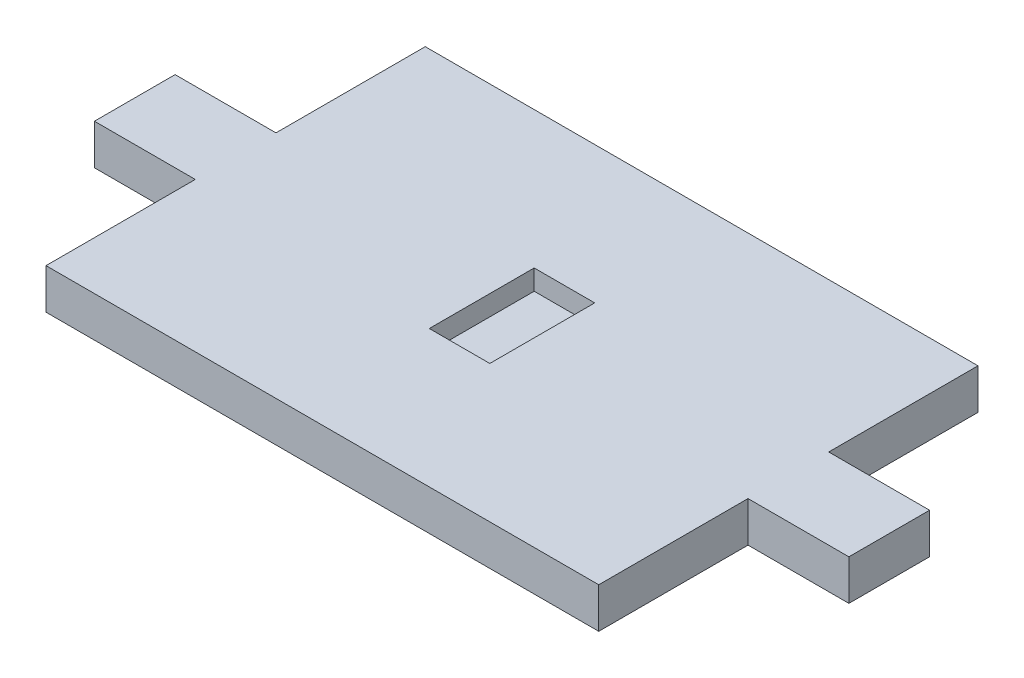
ISO-10303-21;
HEADER;
FILE_DESCRIPTION(('STEP AP214'),'2;1');
FILE_NAME('part.step','',(''),(''),'','','');
FILE_SCHEMA(('AUTOMOTIVE_DESIGN { 1 0 10303 214 1 1 1 1 }'));
ENDSEC;
DATA;
#1=APPLICATION_CONTEXT('core data for automotive mechanical design processes');
#2=APPLICATION_PROTOCOL_DEFINITION('international standard','automotive_design',2000,#1);
#3=PRODUCT_CONTEXT('',#1,'mechanical');
#4=PRODUCT('Part','Part','',(#3));
#5=PRODUCT_RELATED_PRODUCT_CATEGORY('part','',(#4));
#6=PRODUCT_DEFINITION_FORMATION('','',#4);
#7=PRODUCT_DEFINITION_CONTEXT('part definition',#1,'design');
#8=PRODUCT_DEFINITION('design','',#6,#7);
#9=PRODUCT_DEFINITION_SHAPE('','',#8);
#10=(LENGTH_UNIT() NAMED_UNIT(*) SI_UNIT(.MILLI.,.METRE.));
#11=(NAMED_UNIT(*) PLANE_ANGLE_UNIT() SI_UNIT($,.RADIAN.));
#12=(NAMED_UNIT(*) SI_UNIT($,.STERADIAN.) SOLID_ANGLE_UNIT());
#13=UNCERTAINTY_MEASURE_WITH_UNIT(LENGTH_MEASURE(1.E-05),#10,'distance_accuracy_value','');
#14=(GEOMETRIC_REPRESENTATION_CONTEXT(3) GLOBAL_UNCERTAINTY_ASSIGNED_CONTEXT((#13)) GLOBAL_UNIT_ASSIGNED_CONTEXT((#10,
#11,#12)) REPRESENTATION_CONTEXT('',''));
#15=CARTESIAN_POINT('',(0.,0.,0.));
#16=DIRECTION('',(0.,0.,1.));
#17=DIRECTION('',(1.,0.,0.));
#18=AXIS2_PLACEMENT_3D('',#15,#16,#17);
#19=CARTESIAN_POINT('',(-68.5000000000001,10.,-9.99999999999996));
#20=DIRECTION('',(0.,0.,1.));
#21=DIRECTION('',(1.,0.,0.));
#22=AXIS2_PLACEMENT_3D('',#19,#20,#21);
#23=PLANE('',#22);
#24=DIRECTION('',(-1.,0.,0.));
#25=VECTOR('',#24,1.);
#26=CARTESIAN_POINT('',(-68.5000000000001,0.,-9.99999999999996));
#27=LINE('',#26,#25);
#28=CARTESIAN_POINT('',(-68.5000000000001,0.,-9.99999999999996));
#29=VERTEX_POINT('',#28);
#30=CARTESIAN_POINT('',(-93.5000000000001,0.,-10.));
#31=VERTEX_POINT('',#30);
#32=EDGE_CURVE('E179',#29,#31,#27,.T.);
#33=ORIENTED_EDGE('',*,*,#32,.T.);
#34=DIRECTION('',(0.,-1.,0.));
#35=VECTOR('',#34,1.);
#36=CARTESIAN_POINT('',(-93.5000000000001,10.,-10.));
#37=LINE('',#36,#35);
#38=CARTESIAN_POINT('',(-93.5000000000001,10.,-10.));
#39=VERTEX_POINT('',#38);
#40=EDGE_CURVE('E11',#39,#31,#37,.T.);
#41=ORIENTED_EDGE('',*,*,#40,.F.);
#42=DIRECTION('',(-1.,0.,0.));
#43=VECTOR('',#42,1.);
#44=CARTESIAN_POINT('',(-68.5000000000001,10.,-9.99999999999996));
#45=LINE('',#44,#43);
#46=CARTESIAN_POINT('',(-68.5000000000001,10.,-9.99999999999996));
#47=VERTEX_POINT('',#46);
#48=EDGE_CURVE('E203',#47,#39,#45,.T.);
#49=ORIENTED_EDGE('',*,*,#48,.F.);
#50=DIRECTION('',(0.,-1.,0.));
#51=VECTOR('',#50,1.);
#52=CARTESIAN_POINT('',(-68.5000000000001,10.,-9.99999999999996));
#53=LINE('',#52,#51);
#54=EDGE_CURVE('E175',#47,#29,#53,.T.);
#55=ORIENTED_EDGE('',*,*,#54,.T.);
#56=EDGE_LOOP('',(#33,#41,#49,#55));
#57=FACE_BOUND('',#56,.T.);
#58=ADVANCED_FACE('F47',(#57),#23,.F.);
#59=CARTESIAN_POINT('',(-93.5000000000001,10.,10.));
#60=DIRECTION('',(1.,0.,0.));
#61=DIRECTION('',(0.,0.,-1.));
#62=AXIS2_PLACEMENT_3D('',#59,#60,#61);
#63=PLANE('',#62);
#64=DIRECTION('',(0.,0.,1.));
#65=VECTOR('',#64,1.);
#66=CARTESIAN_POINT('',(-93.5000000000001,0.,10.));
#67=LINE('',#66,#65);
#68=CARTESIAN_POINT('',(-93.5000000000001,0.,10.));
#69=VERTEX_POINT('',#68);
#70=EDGE_CURVE('E182',#31,#69,#67,.T.);
#71=ORIENTED_EDGE('',*,*,#70,.T.);
#72=DIRECTION('',(0.,-1.,0.));
#73=VECTOR('',#72,1.);
#74=CARTESIAN_POINT('',(-93.5000000000001,10.,10.));
#75=LINE('',#74,#73);
#76=CARTESIAN_POINT('',(-93.5000000000001,10.,10.));
#77=VERTEX_POINT('',#76);
#78=EDGE_CURVE('E54',#77,#69,#75,.T.);
#79=ORIENTED_EDGE('',*,*,#78,.F.);
#80=DIRECTION('',(0.,0.,1.));
#81=VECTOR('',#80,1.);
#82=CARTESIAN_POINT('',(-93.5000000000001,10.,10.));
#83=LINE('',#82,#81);
#84=EDGE_CURVE('E123',#39,#77,#83,.T.);
#85=ORIENTED_EDGE('',*,*,#84,.F.);
#86=ORIENTED_EDGE('',*,*,#40,.T.);
#87=EDGE_LOOP('',(#71,#79,#85,#86));
#88=FACE_BOUND('',#87,.T.);
#89=ADVANCED_FACE('F344',(#88),#63,.F.);
#90=CARTESIAN_POINT('',(-68.5000000000001,10.,9.99999999999996));
#91=DIRECTION('',(0.,0.,-1.));
#92=DIRECTION('',(-1.,0.,0.));
#93=AXIS2_PLACEMENT_3D('',#90,#91,#92);
#94=PLANE('',#93);
#95=DIRECTION('',(1.,0.,0.));
#96=VECTOR('',#95,1.);
#97=CARTESIAN_POINT('',(-68.5000000000001,0.,9.99999999999996));
#98=LINE('',#97,#96);
#99=CARTESIAN_POINT('',(-68.5000000000001,0.,9.99999999999996));
#100=VERTEX_POINT('',#99);
#101=EDGE_CURVE('E185',#69,#100,#98,.T.);
#102=ORIENTED_EDGE('',*,*,#101,.T.);
#103=DIRECTION('',(0.,-1.,0.));
#104=VECTOR('',#103,1.);
#105=CARTESIAN_POINT('',(-68.5000000000001,10.,9.99999999999996));
#106=LINE('',#105,#104);
#107=CARTESIAN_POINT('',(-68.5000000000001,10.,9.99999999999996));
#108=VERTEX_POINT('',#107);
#109=EDGE_CURVE('E222',#108,#100,#106,.T.);
#110=ORIENTED_EDGE('',*,*,#109,.F.);
#111=DIRECTION('',(1.,0.,0.));
#112=VECTOR('',#111,1.);
#113=CARTESIAN_POINT('',(-68.5000000000001,10.,9.99999999999996));
#114=LINE('',#113,#112);
#115=EDGE_CURVE('E230',#77,#108,#114,.T.);
#116=ORIENTED_EDGE('',*,*,#115,.F.);
#117=ORIENTED_EDGE('',*,*,#78,.T.);
#118=EDGE_LOOP('',(#102,#110,#116,#117));
#119=FACE_BOUND('',#118,.T.);
#120=ADVANCED_FACE('F228',(#119),#94,.F.);
#121=CARTESIAN_POINT('',(-68.5000000000001,10.,9.99999999999996));
#122=DIRECTION('',(1.,0.,0.));
#123=DIRECTION('',(0.,0.,-1.));
#124=AXIS2_PLACEMENT_3D('',#121,#122,#123);
#125=PLANE('',#124);
#126=DIRECTION('',(0.,0.,1.));
#127=VECTOR('',#126,1.);
#128=CARTESIAN_POINT('',(-68.5000000000001,0.,9.99999999999996));
#129=LINE('',#128,#127);
#130=CARTESIAN_POINT('',(-68.5000000000001,0.,47.));
#131=VERTEX_POINT('',#130);
#132=EDGE_CURVE('E187',#100,#131,#129,.T.);
#133=ORIENTED_EDGE('',*,*,#132,.T.);
#134=DIRECTION('',(0.,-1.,0.));
#135=VECTOR('',#134,1.);
#136=CARTESIAN_POINT('',(-68.5000000000001,10.,47.));
#137=LINE('',#136,#135);
#138=CARTESIAN_POINT('',(-68.5000000000001,10.,47.));
#139=VERTEX_POINT('',#138);
#140=EDGE_CURVE('E219',#139,#131,#137,.T.);
#141=ORIENTED_EDGE('',*,*,#140,.F.);
#142=DIRECTION('',(0.,0.,1.));
#143=VECTOR('',#142,1.);
#144=CARTESIAN_POINT('',(-68.5000000000001,10.,9.99999999999996));
#145=LINE('',#144,#143);
#146=EDGE_CURVE('E248',#108,#139,#145,.T.);
#147=ORIENTED_EDGE('',*,*,#146,.F.);
#148=ORIENTED_EDGE('',*,*,#109,.T.);
#149=EDGE_LOOP('',(#133,#141,#147,#148));
#150=FACE_BOUND('',#149,.T.);
#151=ADVANCED_FACE('F239',(#150),#125,.F.);
#152=CARTESIAN_POINT('',(-68.5000000000001,10.,47.));
#153=DIRECTION('',(0.,0.,-1.));
#154=DIRECTION('',(-1.,0.,0.));
#155=AXIS2_PLACEMENT_3D('',#152,#153,#154);
#156=PLANE('',#155);
#157=DIRECTION('',(1.,0.,0.));
#158=VECTOR('',#157,1.);
#159=CARTESIAN_POINT('',(-68.5000000000001,0.,47.));
#160=LINE('',#159,#158);
#161=CARTESIAN_POINT('',(68.4999999999999,0.,47.));
#162=VERTEX_POINT('',#161);
#163=EDGE_CURVE('E189',#131,#162,#160,.T.);
#164=ORIENTED_EDGE('',*,*,#163,.T.);
#165=DIRECTION('',(0.,-1.,0.));
#166=VECTOR('',#165,1.);
#167=CARTESIAN_POINT('',(68.4999999999999,10.,47.));
#168=LINE('',#167,#166);
#169=CARTESIAN_POINT('',(68.4999999999999,10.,47.));
#170=VERTEX_POINT('',#169);
#171=EDGE_CURVE('E216',#170,#162,#168,.T.);
#172=ORIENTED_EDGE('',*,*,#171,.F.);
#173=DIRECTION('',(1.,0.,0.));
#174=VECTOR('',#173,1.);
#175=CARTESIAN_POINT('',(-68.5000000000001,10.,47.));
#176=LINE('',#175,#174);
#177=EDGE_CURVE('E245',#139,#170,#176,.T.);
#178=ORIENTED_EDGE('',*,*,#177,.F.);
#179=ORIENTED_EDGE('',*,*,#140,.T.);
#180=EDGE_LOOP('',(#164,#172,#178,#179));
#181=FACE_BOUND('',#180,.T.);
#182=ADVANCED_FACE('F243',(#181),#156,.F.);
#183=CARTESIAN_POINT('',(68.4999999999999,10.,9.99999999999997));
#184=DIRECTION('',(-1.,0.,0.));
#185=DIRECTION('',(0.,0.,1.));
#186=AXIS2_PLACEMENT_3D('',#183,#184,#185);
#187=PLANE('',#186);
#188=DIRECTION('',(0.,0.,-1.));
#189=VECTOR('',#188,1.);
#190=CARTESIAN_POINT('',(68.4999999999999,0.,9.99999999999997));
#191=LINE('',#190,#189);
#192=CARTESIAN_POINT('',(68.4999999999999,0.,9.99999999999997));
#193=VERTEX_POINT('',#192);
#194=EDGE_CURVE('E191',#162,#193,#191,.T.);
#195=ORIENTED_EDGE('',*,*,#194,.T.);
#196=DIRECTION('',(0.,-1.,0.));
#197=VECTOR('',#196,1.);
#198=CARTESIAN_POINT('',(68.4999999999999,10.,9.99999999999997));
#199=LINE('',#198,#197);
#200=CARTESIAN_POINT('',(68.4999999999999,10.,9.99999999999997));
#201=VERTEX_POINT('',#200);
#202=EDGE_CURVE('E213',#201,#193,#199,.T.);
#203=ORIENTED_EDGE('',*,*,#202,.F.);
#204=DIRECTION('',(0.,0.,-1.));
#205=VECTOR('',#204,1.);
#206=CARTESIAN_POINT('',(68.4999999999999,10.,9.99999999999997));
#207=LINE('',#206,#205);
#208=EDGE_CURVE('E247',#170,#201,#207,.T.);
#209=ORIENTED_EDGE('',*,*,#208,.F.);
#210=ORIENTED_EDGE('',*,*,#171,.T.);
#211=EDGE_LOOP('',(#195,#203,#209,#210));
#212=FACE_BOUND('',#211,.T.);
#213=ADVANCED_FACE('F357',(#212),#187,.F.);
#214=CARTESIAN_POINT('',(93.4999999999999,10.,9.99999999999998));
#215=DIRECTION('',(0.,0.,-1.));
#216=DIRECTION('',(-1.,0.,0.));
#217=AXIS2_PLACEMENT_3D('',#214,#215,#216);
#218=PLANE('',#217);
#219=DIRECTION('',(1.,0.,0.));
#220=VECTOR('',#219,1.);
#221=CARTESIAN_POINT('',(93.4999999999999,0.,9.99999999999998));
#222=LINE('',#221,#220);
#223=CARTESIAN_POINT('',(93.4999999999999,0.,9.99999999999998));
#224=VERTEX_POINT('',#223);
#225=EDGE_CURVE('E193',#193,#224,#222,.T.);
#226=ORIENTED_EDGE('',*,*,#225,.T.);
#227=DIRECTION('',(0.,-1.,0.));
#228=VECTOR('',#227,1.);
#229=CARTESIAN_POINT('',(93.4999999999999,10.,9.99999999999998));
#230=LINE('',#229,#228);
#231=CARTESIAN_POINT('',(93.4999999999999,10.,9.99999999999998));
#232=VERTEX_POINT('',#231);
#233=EDGE_CURVE('E210',#232,#224,#230,.T.);
#234=ORIENTED_EDGE('',*,*,#233,.F.);
#235=DIRECTION('',(1.,0.,0.));
#236=VECTOR('',#235,1.);
#237=CARTESIAN_POINT('',(93.4999999999999,10.,9.99999999999998));
#238=LINE('',#237,#236);
#239=EDGE_CURVE('E250',#201,#232,#238,.T.);
#240=ORIENTED_EDGE('',*,*,#239,.F.);
#241=ORIENTED_EDGE('',*,*,#202,.T.);
#242=EDGE_LOOP('',(#226,#234,#240,#241));
#243=FACE_BOUND('',#242,.T.);
#244=ADVANCED_FACE('F360',(#243),#218,.F.);
#245=CARTESIAN_POINT('',(93.4999999999999,10.,9.99999999999998));
#246=DIRECTION('',(-1.,0.,0.));
#247=DIRECTION('',(0.,0.,1.));
#248=AXIS2_PLACEMENT_3D('',#245,#246,#247);
#249=PLANE('',#248);
#250=DIRECTION('',(0.,0.,-1.));
#251=VECTOR('',#250,1.);
#252=CARTESIAN_POINT('',(93.4999999999999,0.,9.99999999999998));
#253=LINE('',#252,#251);
#254=CARTESIAN_POINT('',(93.4999999999999,0.,-9.99999999999998));
#255=VERTEX_POINT('',#254);
#256=EDGE_CURVE('E195',#224,#255,#253,.T.);
#257=ORIENTED_EDGE('',*,*,#256,.T.);
#258=DIRECTION('',(0.,-1.,0.));
#259=VECTOR('',#258,1.);
#260=CARTESIAN_POINT('',(93.4999999999999,10.,-9.99999999999998));
#261=LINE('',#260,#259);
#262=CARTESIAN_POINT('',(93.4999999999999,10.,-9.99999999999998));
#263=VERTEX_POINT('',#262);
#264=EDGE_CURVE('E207',#263,#255,#261,.T.);
#265=ORIENTED_EDGE('',*,*,#264,.F.);
#266=DIRECTION('',(0.,0.,-1.));
#267=VECTOR('',#266,1.);
#268=CARTESIAN_POINT('',(93.4999999999999,10.,9.99999999999998));
#269=LINE('',#268,#267);
#270=EDGE_CURVE('E256',#232,#263,#269,.T.);
#271=ORIENTED_EDGE('',*,*,#270,.F.);
#272=ORIENTED_EDGE('',*,*,#233,.T.);
#273=EDGE_LOOP('',(#257,#265,#271,#272));
#274=FACE_BOUND('',#273,.T.);
#275=ADVANCED_FACE('F262',(#274),#249,.F.);
#276=CARTESIAN_POINT('',(93.4999999999999,10.,-9.99999999999998));
#277=DIRECTION('',(0.,0.,1.));
#278=DIRECTION('',(1.,0.,0.));
#279=AXIS2_PLACEMENT_3D('',#276,#277,#278);
#280=PLANE('',#279);
#281=DIRECTION('',(-1.,0.,0.));
#282=VECTOR('',#281,1.);
#283=CARTESIAN_POINT('',(93.4999999999999,0.,-9.99999999999998));
#284=LINE('',#283,#282);
#285=CARTESIAN_POINT('',(68.4999999999999,0.,-9.99999999999997));
#286=VERTEX_POINT('',#285);
#287=EDGE_CURVE('E197',#255,#286,#284,.T.);
#288=ORIENTED_EDGE('',*,*,#287,.T.);
#289=DIRECTION('',(0.,-1.,0.));
#290=VECTOR('',#289,1.);
#291=CARTESIAN_POINT('',(68.4999999999999,10.,-9.99999999999997));
#292=LINE('',#291,#290);
#293=CARTESIAN_POINT('',(68.4999999999999,10.,-9.99999999999997));
#294=VERTEX_POINT('',#293);
#295=EDGE_CURVE('E170',#294,#286,#292,.T.);
#296=ORIENTED_EDGE('',*,*,#295,.F.);
#297=DIRECTION('',(-1.,0.,0.));
#298=VECTOR('',#297,1.);
#299=CARTESIAN_POINT('',(93.4999999999999,10.,-9.99999999999998));
#300=LINE('',#299,#298);
#301=EDGE_CURVE('E158',#263,#294,#300,.T.);
#302=ORIENTED_EDGE('',*,*,#301,.F.);
#303=ORIENTED_EDGE('',*,*,#264,.T.);
#304=EDGE_LOOP('',(#288,#296,#302,#303));
#305=FACE_BOUND('',#304,.T.);
#306=ADVANCED_FACE('F266',(#305),#280,.F.);
#307=CARTESIAN_POINT('',(68.4999999999999,10.,-9.99999999999997));
#308=DIRECTION('',(-1.,0.,0.));
#309=DIRECTION('',(0.,0.,1.));
#310=AXIS2_PLACEMENT_3D('',#307,#308,#309);
#311=PLANE('',#310);
#312=DIRECTION('',(0.,0.,-1.));
#313=VECTOR('',#312,1.);
#314=CARTESIAN_POINT('',(68.4999999999999,0.,-9.99999999999997));
#315=LINE('',#314,#313);
#316=CARTESIAN_POINT('',(68.4999999999999,0.,-47.));
#317=VERTEX_POINT('',#316);
#318=EDGE_CURVE('E167',#286,#317,#315,.T.);
#319=ORIENTED_EDGE('',*,*,#318,.T.);
#320=DIRECTION('',(0.,-1.,0.));
#321=VECTOR('',#320,1.);
#322=CARTESIAN_POINT('',(68.4999999999999,10.,-47.));
#323=LINE('',#322,#321);
#324=CARTESIAN_POINT('',(68.4999999999999,10.,-47.));
#325=VERTEX_POINT('',#324);
#326=EDGE_CURVE('E164',#325,#317,#323,.T.);
#327=ORIENTED_EDGE('',*,*,#326,.F.);
#328=DIRECTION('',(0.,0.,-1.));
#329=VECTOR('',#328,1.);
#330=CARTESIAN_POINT('',(68.4999999999999,10.,-9.99999999999997));
#331=LINE('',#330,#329);
#332=EDGE_CURVE('E151',#294,#325,#331,.T.);
#333=ORIENTED_EDGE('',*,*,#332,.F.);
#334=ORIENTED_EDGE('',*,*,#295,.T.);
#335=EDGE_LOOP('',(#319,#327,#333,#334));
#336=FACE_BOUND('',#335,.T.);
#337=ADVANCED_FACE('F165',(#336),#311,.F.);
#338=CARTESIAN_POINT('',(-68.5000000000001,10.,-47.));
#339=DIRECTION('',(0.,0.,1.));
#340=DIRECTION('',(1.,0.,0.));
#341=AXIS2_PLACEMENT_3D('',#338,#339,#340);
#342=PLANE('',#341);
#343=DIRECTION('',(-1.,0.,0.));
#344=VECTOR('',#343,1.);
#345=CARTESIAN_POINT('',(-68.5000000000001,0.,-47.));
#346=LINE('',#345,#344);
#347=CARTESIAN_POINT('',(-68.5000000000001,0.,-47.));
#348=VERTEX_POINT('',#347);
#349=EDGE_CURVE('E200',#317,#348,#346,.T.);
#350=ORIENTED_EDGE('',*,*,#349,.T.);
#351=DIRECTION('',(0.,-1.,0.));
#352=VECTOR('',#351,1.);
#353=CARTESIAN_POINT('',(-68.5000000000001,10.,-47.));
#354=LINE('',#353,#352);
#355=CARTESIAN_POINT('',(-68.5000000000001,10.,-47.));
#356=VERTEX_POINT('',#355);
#357=EDGE_CURVE('E171',#356,#348,#354,.T.);
#358=ORIENTED_EDGE('',*,*,#357,.F.);
#359=DIRECTION('',(-1.,0.,0.));
#360=VECTOR('',#359,1.);
#361=CARTESIAN_POINT('',(-68.5000000000001,10.,-47.));
#362=LINE('',#361,#360);
#363=EDGE_CURVE('E155',#325,#356,#362,.T.);
#364=ORIENTED_EDGE('',*,*,#363,.F.);
#365=ORIENTED_EDGE('',*,*,#326,.T.);
#366=EDGE_LOOP('',(#350,#358,#364,#365));
#367=FACE_BOUND('',#366,.T.);
#368=ADVANCED_FACE('F173',(#367),#342,.F.);
#369=CARTESIAN_POINT('',(-68.5000000000001,10.,-9.99999999999996));
#370=DIRECTION('',(1.,0.,0.));
#371=DIRECTION('',(0.,0.,-1.));
#372=AXIS2_PLACEMENT_3D('',#369,#370,#371);
#373=PLANE('',#372);
#374=DIRECTION('',(0.,0.,1.));
#375=VECTOR('',#374,1.);
#376=CARTESIAN_POINT('',(-68.5000000000001,0.,-9.99999999999996));
#377=LINE('',#376,#375);
#378=EDGE_CURVE('E115',#348,#29,#377,.T.);
#379=ORIENTED_EDGE('',*,*,#378,.T.);
#380=ORIENTED_EDGE('',*,*,#54,.F.);
#381=DIRECTION('',(0.,0.,1.));
#382=VECTOR('',#381,1.);
#383=CARTESIAN_POINT('',(-68.5000000000001,10.,-9.99999999999996));
#384=LINE('',#383,#382);
#385=EDGE_CURVE('E70',#356,#47,#384,.T.);
#386=ORIENTED_EDGE('',*,*,#385,.F.);
#387=ORIENTED_EDGE('',*,*,#357,.T.);
#388=EDGE_LOOP('',(#379,#380,#386,#387));
#389=FACE_BOUND('',#388,.T.);
#390=ADVANCED_FACE('F267',(#389),#373,.F.);
#391=CARTESIAN_POINT('',(0.,10.,0.));
#392=DIRECTION('',(0.,-1.,0.));
#393=DIRECTION('',(0.,0.,-1.));
#394=AXIS2_PLACEMENT_3D('',#391,#392,#393);
#395=PLANE('',#394);
#396=DIRECTION('',(1.,0.,0.));
#397=VECTOR('',#396,1.);
#398=CARTESIAN_POINT('',(7.5,10.,13.));
#399=LINE('',#398,#397);
#400=CARTESIAN_POINT('',(-7.5,10.,13.));
#401=VERTEX_POINT('',#400);
#402=CARTESIAN_POINT('',(7.5,10.,13.));
#403=VERTEX_POINT('',#402);
#404=EDGE_CURVE('E291',#401,#403,#399,.T.);
#405=ORIENTED_EDGE('',*,*,#404,.F.);
#406=DIRECTION('',(0.,0.,1.));
#407=VECTOR('',#406,1.);
#408=CARTESIAN_POINT('',(-7.5,10.,-13.));
#409=LINE('',#408,#407);
#410=CARTESIAN_POINT('',(-7.5,10.,-13.));
#411=VERTEX_POINT('',#410);
#412=EDGE_CURVE('E61',#411,#401,#409,.T.);
#413=ORIENTED_EDGE('',*,*,#412,.F.);
#414=DIRECTION('',(-1.,0.,0.));
#415=VECTOR('',#414,1.);
#416=CARTESIAN_POINT('',(7.5,10.,-13.));
#417=LINE('',#416,#415);
#418=CARTESIAN_POINT('',(7.5,10.,-13.));
#419=VERTEX_POINT('',#418);
#420=EDGE_CURVE('E284',#419,#411,#417,.T.);
#421=ORIENTED_EDGE('',*,*,#420,.F.);
#422=DIRECTION('',(0.,0.,-1.));
#423=VECTOR('',#422,1.);
#424=CARTESIAN_POINT('',(7.5,10.,-13.));
#425=LINE('',#424,#423);
#426=EDGE_CURVE('E288',#403,#419,#425,.T.);
#427=ORIENTED_EDGE('',*,*,#426,.F.);
#428=EDGE_LOOP('',(#405,#413,#421,#427));
#429=FACE_BOUND('',#428,.T.);
#430=ORIENTED_EDGE('',*,*,#48,.T.);
#431=ORIENTED_EDGE('',*,*,#84,.T.);
#432=ORIENTED_EDGE('',*,*,#115,.T.);
#433=ORIENTED_EDGE('',*,*,#146,.T.);
#434=ORIENTED_EDGE('',*,*,#177,.T.);
#435=ORIENTED_EDGE('',*,*,#208,.T.);
#436=ORIENTED_EDGE('',*,*,#239,.T.);
#437=ORIENTED_EDGE('',*,*,#270,.T.);
#438=ORIENTED_EDGE('',*,*,#301,.T.);
#439=ORIENTED_EDGE('',*,*,#332,.T.);
#440=ORIENTED_EDGE('',*,*,#363,.T.);
#441=ORIENTED_EDGE('',*,*,#385,.T.);
#442=EDGE_LOOP('',(#430,#431,#432,#433,#434,#435,#436,#437,#438,#439,#440,#441));
#443=FACE_BOUND('',#442,.T.);
#444=ADVANCED_FACE('F153',(#429,#443),#395,.F.);
#445=CARTESIAN_POINT('',(0.,0.,0.));
#446=DIRECTION('',(0.,-1.,0.));
#447=DIRECTION('',(0.,0.,-1.));
#448=AXIS2_PLACEMENT_3D('',#445,#446,#447);
#449=PLANE('',#448);
#450=ORIENTED_EDGE('',*,*,#32,.F.);
#451=ORIENTED_EDGE('',*,*,#378,.F.);
#452=ORIENTED_EDGE('',*,*,#349,.F.);
#453=ORIENTED_EDGE('',*,*,#318,.F.);
#454=ORIENTED_EDGE('',*,*,#287,.F.);
#455=ORIENTED_EDGE('',*,*,#256,.F.);
#456=ORIENTED_EDGE('',*,*,#225,.F.);
#457=ORIENTED_EDGE('',*,*,#194,.F.);
#458=ORIENTED_EDGE('',*,*,#163,.F.);
#459=ORIENTED_EDGE('',*,*,#132,.F.);
#460=ORIENTED_EDGE('',*,*,#101,.F.);
#461=ORIENTED_EDGE('',*,*,#70,.F.);
#462=EDGE_LOOP('',(#450,#451,#452,#453,#454,#455,#456,#457,#458,#459,#460,#461));
#463=FACE_BOUND('',#462,.T.);
#464=ADVANCED_FACE('F234',(#463),#449,.T.);
#465=CARTESIAN_POINT('',(-7.5,5.,-13.));
#466=DIRECTION('',(-1.,0.,0.));
#467=DIRECTION('',(0.,0.,1.));
#468=AXIS2_PLACEMENT_3D('',#465,#466,#467);
#469=PLANE('',#468);
#470=ORIENTED_EDGE('',*,*,#412,.T.);
#471=DIRECTION('',(0.,1.,0.));
#472=VECTOR('',#471,1.);
#473=CARTESIAN_POINT('',(-7.5,5.,13.));
#474=LINE('',#473,#472);
#475=CARTESIAN_POINT('',(-7.5,5.,13.));
#476=VERTEX_POINT('',#475);
#477=EDGE_CURVE('E274',#476,#401,#474,.T.);
#478=ORIENTED_EDGE('',*,*,#477,.F.);
#479=DIRECTION('',(0.,0.,1.));
#480=VECTOR('',#479,1.);
#481=CARTESIAN_POINT('',(-7.5,5.,-13.));
#482=LINE('',#481,#480);
#483=CARTESIAN_POINT('',(-7.5,5.,-13.));
#484=VERTEX_POINT('',#483);
#485=EDGE_CURVE('E287',#484,#476,#482,.T.);
#486=ORIENTED_EDGE('',*,*,#485,.F.);
#487=DIRECTION('',(0.,1.,0.));
#488=VECTOR('',#487,1.);
#489=CARTESIAN_POINT('',(-7.5,5.,-13.));
#490=LINE('',#489,#488);
#491=EDGE_CURVE('E183',#484,#411,#490,.T.);
#492=ORIENTED_EDGE('',*,*,#491,.T.);
#493=EDGE_LOOP('',(#470,#478,#486,#492));
#494=FACE_BOUND('',#493,.T.);
#495=ADVANCED_FACE('F312',(#494),#469,.F.);
#496=CARTESIAN_POINT('',(7.5,5.,-13.));
#497=DIRECTION('',(0.,0.,-1.));
#498=DIRECTION('',(-1.,0.,0.));
#499=AXIS2_PLACEMENT_3D('',#496,#497,#498);
#500=PLANE('',#499);
#501=ORIENTED_EDGE('',*,*,#420,.T.);
#502=ORIENTED_EDGE('',*,*,#491,.F.);
#503=DIRECTION('',(-1.,0.,0.));
#504=VECTOR('',#503,1.);
#505=CARTESIAN_POINT('',(7.5,5.,-13.));
#506=LINE('',#505,#504);
#507=CARTESIAN_POINT('',(7.5,5.,-13.));
#508=VERTEX_POINT('',#507);
#509=EDGE_CURVE('E277',#508,#484,#506,.T.);
#510=ORIENTED_EDGE('',*,*,#509,.F.);
#511=DIRECTION('',(0.,1.,0.));
#512=VECTOR('',#511,1.);
#513=CARTESIAN_POINT('',(7.5,5.,-13.));
#514=LINE('',#513,#512);
#515=EDGE_CURVE('E280',#508,#419,#514,.T.);
#516=ORIENTED_EDGE('',*,*,#515,.T.);
#517=EDGE_LOOP('',(#501,#502,#510,#516));
#518=FACE_BOUND('',#517,.T.);
#519=ADVANCED_FACE('F323',(#518),#500,.F.);
#520=CARTESIAN_POINT('',(7.5,5.,-13.));
#521=DIRECTION('',(1.,0.,0.));
#522=DIRECTION('',(0.,0.,-1.));
#523=AXIS2_PLACEMENT_3D('',#520,#521,#522);
#524=PLANE('',#523);
#525=ORIENTED_EDGE('',*,*,#426,.T.);
#526=ORIENTED_EDGE('',*,*,#515,.F.);
#527=DIRECTION('',(0.,0.,-1.));
#528=VECTOR('',#527,1.);
#529=CARTESIAN_POINT('',(7.5,5.,-13.));
#530=LINE('',#529,#528);
#531=CARTESIAN_POINT('',(7.5,5.,13.));
#532=VERTEX_POINT('',#531);
#533=EDGE_CURVE('E297',#532,#508,#530,.T.);
#534=ORIENTED_EDGE('',*,*,#533,.F.);
#535=DIRECTION('',(0.,1.,0.));
#536=VECTOR('',#535,1.);
#537=CARTESIAN_POINT('',(7.5,5.,13.));
#538=LINE('',#537,#536);
#539=EDGE_CURVE('E276',#532,#403,#538,.T.);
#540=ORIENTED_EDGE('',*,*,#539,.T.);
#541=EDGE_LOOP('',(#525,#526,#534,#540));
#542=FACE_BOUND('',#541,.T.);
#543=ADVANCED_FACE('F328',(#542),#524,.F.);
#544=CARTESIAN_POINT('',(7.5,5.,13.));
#545=DIRECTION('',(0.,0.,1.));
#546=DIRECTION('',(1.,0.,0.));
#547=AXIS2_PLACEMENT_3D('',#544,#545,#546);
#548=PLANE('',#547);
#549=ORIENTED_EDGE('',*,*,#404,.T.);
#550=ORIENTED_EDGE('',*,*,#539,.F.);
#551=DIRECTION('',(1.,0.,0.));
#552=VECTOR('',#551,1.);
#553=CARTESIAN_POINT('',(7.5,5.,13.));
#554=LINE('',#553,#552);
#555=EDGE_CURVE('E300',#476,#532,#554,.T.);
#556=ORIENTED_EDGE('',*,*,#555,.F.);
#557=ORIENTED_EDGE('',*,*,#477,.T.);
#558=EDGE_LOOP('',(#549,#550,#556,#557));
#559=FACE_BOUND('',#558,.T.);
#560=ADVANCED_FACE('F333',(#559),#548,.F.);
#561=CARTESIAN_POINT('',(0.,5.,0.));
#562=DIRECTION('',(0.,-1.,0.));
#563=DIRECTION('',(0.,0.,-1.));
#564=AXIS2_PLACEMENT_3D('',#561,#562,#563);
#565=PLANE('',#564);
#566=ORIENTED_EDGE('',*,*,#485,.T.);
#567=ORIENTED_EDGE('',*,*,#555,.T.);
#568=ORIENTED_EDGE('',*,*,#533,.T.);
#569=ORIENTED_EDGE('',*,*,#509,.T.);
#570=EDGE_LOOP('',(#566,#567,#568,#569));
#571=FACE_BOUND('',#570,.T.);
#572=ADVANCED_FACE('F307',(#571),#565,.F.);
#573=CLOSED_SHELL('',(#58,#89,#120,#151,#182,#213,#244,#275,#306,#337,#368,#390,#444,#464,#495,
#519,#543,#560,#572));
#574=MANIFOLD_SOLID_BREP('B2',#573);
#575=ADVANCED_BREP_SHAPE_REPRESENTATION('',(#18,#574),#14);
#576=SHAPE_DEFINITION_REPRESENTATION(#9,#575);
ENDSEC;
END-ISO-10303-21;
